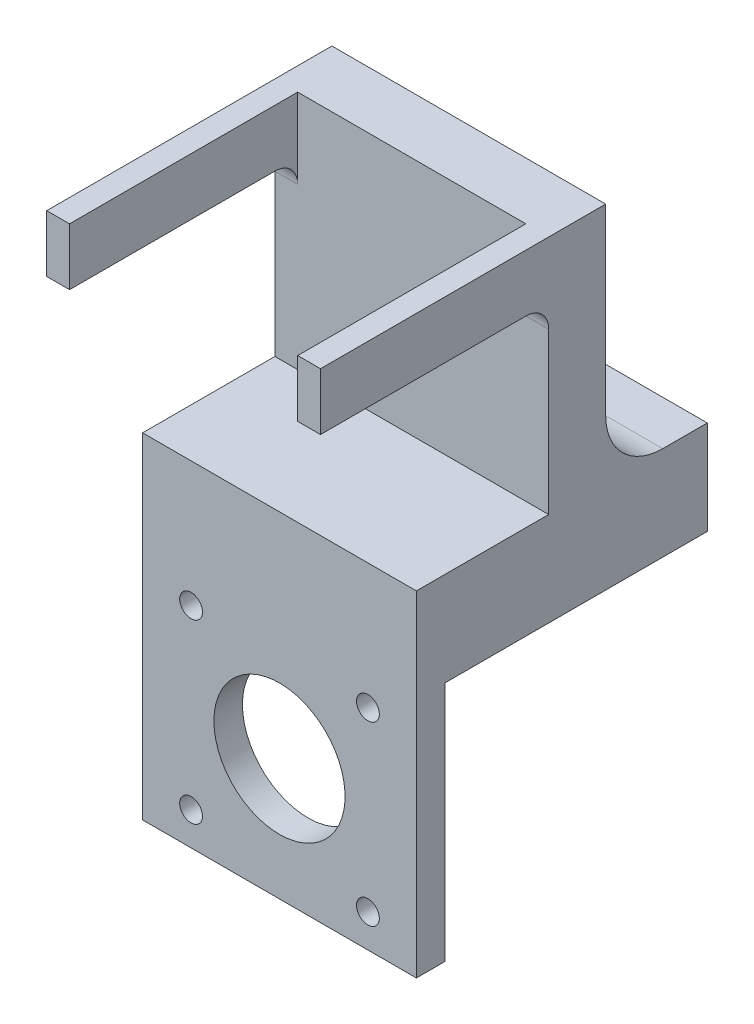
ISO-10303-21;
HEADER;
FILE_DESCRIPTION(('STEP AP214'),'2;1');
FILE_NAME('part.step','',(''),(''),'','','');
FILE_SCHEMA(('AUTOMOTIVE_DESIGN { 1 0 10303 214 1 1 1 1 }'));
ENDSEC;
DATA;
#1=APPLICATION_CONTEXT('core data for automotive mechanical design processes');
#2=APPLICATION_PROTOCOL_DEFINITION('international standard','automotive_design',2000,#1);
#3=PRODUCT_CONTEXT('',#1,'mechanical');
#4=PRODUCT('Part','Part','',(#3));
#5=PRODUCT_RELATED_PRODUCT_CATEGORY('part','',(#4));
#6=PRODUCT_DEFINITION_FORMATION('','',#4);
#7=PRODUCT_DEFINITION_CONTEXT('part definition',#1,'design');
#8=PRODUCT_DEFINITION('design','',#6,#7);
#9=PRODUCT_DEFINITION_SHAPE('','',#8);
#10=(LENGTH_UNIT() NAMED_UNIT(*) SI_UNIT(.MILLI.,.METRE.));
#11=(NAMED_UNIT(*) PLANE_ANGLE_UNIT() SI_UNIT($,.RADIAN.));
#12=(NAMED_UNIT(*) SI_UNIT($,.STERADIAN.) SOLID_ANGLE_UNIT());
#13=UNCERTAINTY_MEASURE_WITH_UNIT(LENGTH_MEASURE(1.E-05),#10,'distance_accuracy_value','');
#14=(GEOMETRIC_REPRESENTATION_CONTEXT(3) GLOBAL_UNCERTAINTY_ASSIGNED_CONTEXT((#13)) GLOBAL_UNIT_ASSIGNED_CONTEXT((#10,
#11,#12)) REPRESENTATION_CONTEXT('',''));
#15=CARTESIAN_POINT('',(0.,0.,0.));
#16=DIRECTION('',(0.,0.,1.));
#17=DIRECTION('',(1.,0.,0.));
#18=AXIS2_PLACEMENT_3D('',#15,#16,#17);
#19=CARTESIAN_POINT('',(0.,0.,0.));
#20=DIRECTION('',(0.,0.,-1.));
#21=DIRECTION('',(-1.,0.,0.));
#22=AXIS2_PLACEMENT_3D('',#19,#20,#21);
#23=PLANE('',#22);
#24=DIRECTION('',(0.,1.,0.));
#25=VECTOR('',#24,1.);
#26=CARTESIAN_POINT('',(48.,0.,0.));
#27=LINE('',#26,#25);
#28=CARTESIAN_POINT('',(48.,20.8609375,0.));
#29=VERTEX_POINT('',#28);
#30=CARTESIAN_POINT('',(48.,53.,0.));
#31=VERTEX_POINT('',#30);
#32=EDGE_CURVE('E316',#29,#31,#27,.T.);
#33=ORIENTED_EDGE('',*,*,#32,.F.);
#34=DIRECTION('',(-1.,0.,0.));
#35=VECTOR('',#34,1.);
#36=CARTESIAN_POINT('',(0.,20.8609375,0.));
#37=LINE('',#36,#35);
#38=CARTESIAN_POINT('',(0.,20.8609375,0.));
#39=VERTEX_POINT('',#38);
#40=EDGE_CURVE('E324',#29,#39,#37,.T.);
#41=ORIENTED_EDGE('',*,*,#40,.T.);
#42=DIRECTION('',(0.,-1.,0.));
#43=VECTOR('',#42,1.);
#44=CARTESIAN_POINT('',(0.,0.,0.));
#45=LINE('',#44,#43);
#46=CARTESIAN_POINT('',(0.,53.,0.));
#47=VERTEX_POINT('',#46);
#48=EDGE_CURVE('E303',#47,#39,#45,.T.);
#49=ORIENTED_EDGE('',*,*,#48,.F.);
#50=DIRECTION('',(-1.,0.,0.));
#51=VECTOR('',#50,1.);
#52=CARTESIAN_POINT('',(0.,53.,0.));
#53=LINE('',#52,#51);
#54=EDGE_CURVE('E308',#31,#47,#53,.T.);
#55=ORIENTED_EDGE('',*,*,#54,.F.);
#56=EDGE_LOOP('',(#33,#41,#49,#55));
#57=FACE_BOUND('',#56,.T.);
#58=ADVANCED_FACE('F33',(#57),#23,.T.);
#59=CARTESIAN_POINT('',(0.,0.,10.));
#60=DIRECTION('',(0.,0.,-1.));
#61=DIRECTION('',(-1.,0.,0.));
#62=AXIS2_PLACEMENT_3D('',#59,#60,#61);
#63=PLANE('',#62);
#64=DIRECTION('',(0.,1.,0.));
#65=VECTOR('',#64,1.);
#66=CARTESIAN_POINT('',(4.,53.,10.));
#67=LINE('',#66,#65);
#68=CARTESIAN_POINT('',(4.,39.,10.));
#69=VERTEX_POINT('',#68);
#70=CARTESIAN_POINT('',(4.,53.,10.));
#71=VERTEX_POINT('',#70);
#72=EDGE_CURVE('E275',#69,#71,#67,.T.);
#73=ORIENTED_EDGE('',*,*,#72,.F.);
#74=DIRECTION('',(1.,0.,0.));
#75=VECTOR('',#74,1.);
#76=CARTESIAN_POINT('',(0.,39.,10.));
#77=LINE('',#76,#75);
#78=CARTESIAN_POINT('',(0.,39.,10.));
#79=VERTEX_POINT('',#78);
#80=EDGE_CURVE('E338',#69,#79,#77,.F.);
#81=ORIENTED_EDGE('',*,*,#80,.T.);
#82=DIRECTION('',(0.,-1.,0.));
#83=VECTOR('',#82,1.);
#84=CARTESIAN_POINT('',(0.,0.,10.));
#85=LINE('',#84,#83);
#86=CARTESIAN_POINT('',(0.,10.8609375,10.));
#87=VERTEX_POINT('',#86);
#88=EDGE_CURVE('E305',#79,#87,#85,.T.);
#89=ORIENTED_EDGE('',*,*,#88,.T.);
#90=DIRECTION('',(-1.,0.,0.));
#91=VECTOR('',#90,1.);
#92=CARTESIAN_POINT('',(0.,10.8609375,10.));
#93=LINE('',#92,#91);
#94=CARTESIAN_POINT('',(48.,10.8609375,10.));
#95=VERTEX_POINT('',#94);
#96=EDGE_CURVE('E244',#95,#87,#93,.T.);
#97=ORIENTED_EDGE('',*,*,#96,.F.);
#98=DIRECTION('',(0.,1.,0.));
#99=VECTOR('',#98,1.);
#100=CARTESIAN_POINT('',(48.,0.,10.));
#101=LINE('',#100,#99);
#102=CARTESIAN_POINT('',(48.,39.,10.));
#103=VERTEX_POINT('',#102);
#104=EDGE_CURVE('E307',#95,#103,#101,.T.);
#105=ORIENTED_EDGE('',*,*,#104,.T.);
#106=DIRECTION('',(1.,0.,0.));
#107=VECTOR('',#106,1.);
#108=CARTESIAN_POINT('',(44.,39.,10.));
#109=LINE('',#108,#107);
#110=CARTESIAN_POINT('',(44.,39.,10.));
#111=VERTEX_POINT('',#110);
#112=EDGE_CURVE('E335',#103,#111,#109,.F.);
#113=ORIENTED_EDGE('',*,*,#112,.T.);
#114=DIRECTION('',(0.,-1.,0.));
#115=VECTOR('',#114,1.);
#116=CARTESIAN_POINT('',(44.,53.,10.));
#117=LINE('',#116,#115);
#118=CARTESIAN_POINT('',(44.,53.,10.));
#119=VERTEX_POINT('',#118);
#120=EDGE_CURVE('E256',#119,#111,#117,.T.);
#121=ORIENTED_EDGE('',*,*,#120,.F.);
#122=DIRECTION('',(-1.,0.,0.));
#123=VECTOR('',#122,1.);
#124=CARTESIAN_POINT('',(0.,53.,10.));
#125=LINE('',#124,#123);
#126=EDGE_CURVE('E311',#119,#71,#125,.T.);
#127=ORIENTED_EDGE('',*,*,#126,.T.);
#128=EDGE_LOOP('',(#73,#81,#89,#97,#105,#113,#121,#127));
#129=FACE_BOUND('',#128,.T.);
#130=ADVANCED_FACE('F350',(#129),#63,.F.);
#131=CARTESIAN_POINT('',(0.,0.,10.));
#132=DIRECTION('',(1.,0.,0.));
#133=DIRECTION('',(0.,0.,-1.));
#134=AXIS2_PLACEMENT_3D('',#131,#132,#133);
#135=PLANE('',#134);
#136=ORIENTED_EDGE('',*,*,#48,.T.);
#137=CARTESIAN_POINT('',(0.,20.8609375,-10.));
#138=DIRECTION('',(1.,0.,0.));
#139=DIRECTION('',(0.,0.,-1.));
#140=AXIS2_PLACEMENT_3D('',#137,#138,#139);
#141=CIRCLE('',#140,10.);
#142=CARTESIAN_POINT('',(0.,10.8609375,-9.99999999999999));
#143=VERTEX_POINT('',#142);
#144=EDGE_CURVE('E328',#39,#143,#141,.T.);
#145=ORIENTED_EDGE('',*,*,#144,.T.);
#146=DIRECTION('',(0.,0.,-1.));
#147=VECTOR('',#146,1.);
#148=CARTESIAN_POINT('',(0.,10.8609375,0.));
#149=LINE('',#148,#147);
#150=CARTESIAN_POINT('',(0.,10.8609375,-17.8082122));
#151=VERTEX_POINT('',#150);
#152=EDGE_CURVE('E174',#143,#151,#149,.T.);
#153=ORIENTED_EDGE('',*,*,#152,.T.);
#154=DIRECTION('',(0.,1.,0.));
#155=VECTOR('',#154,1.);
#156=CARTESIAN_POINT('',(0.,10.8609375,-17.8082122));
#157=LINE('',#156,#155);
#158=CARTESIAN_POINT('',(0.,-5.616325,-17.8082122));
#159=VERTEX_POINT('',#158);
#160=EDGE_CURVE('E183',#159,#151,#157,.T.);
#161=ORIENTED_EDGE('',*,*,#160,.F.);
#162=DIRECTION('',(0.,0.,-1.));
#163=VECTOR('',#162,1.);
#164=CARTESIAN_POINT('',(0.,-5.616325,33.1917878));
#165=LINE('',#164,#163);
#166=CARTESIAN_POINT('',(0.,-5.616325,28.1917878));
#167=VERTEX_POINT('',#166);
#168=EDGE_CURVE('E301',#167,#159,#165,.T.);
#169=ORIENTED_EDGE('',*,*,#168,.F.);
#170=DIRECTION('',(0.,1.,0.));
#171=VECTOR('',#170,1.);
#172=CARTESIAN_POINT('',(0.,-47.916325,28.1917878));
#173=LINE('',#172,#171);
#174=CARTESIAN_POINT('',(0.,-47.916325,28.1917878));
#175=VERTEX_POINT('',#174);
#176=EDGE_CURVE('E241',#175,#167,#173,.T.);
#177=ORIENTED_EDGE('',*,*,#176,.F.);
#178=DIRECTION('',(0.,0.,-1.));
#179=VECTOR('',#178,1.);
#180=CARTESIAN_POINT('',(0.,-47.916325,28.1917878));
#181=LINE('',#180,#179);
#182=CARTESIAN_POINT('',(0.,-47.916325,33.1917878));
#183=VERTEX_POINT('',#182);
#184=EDGE_CURVE('E226',#183,#175,#181,.T.);
#185=ORIENTED_EDGE('',*,*,#184,.F.);
#186=DIRECTION('',(0.,1.,0.));
#187=VECTOR('',#186,1.);
#188=CARTESIAN_POINT('',(0.,0.,33.1917878));
#189=LINE('',#188,#187);
#190=CARTESIAN_POINT('',(0.,10.8609375,33.1917878));
#191=VERTEX_POINT('',#190);
#192=EDGE_CURVE('E299',#183,#191,#189,.T.);
#193=ORIENTED_EDGE('',*,*,#192,.T.);
#194=DIRECTION('',(0.,0.,-1.));
#195=VECTOR('',#194,1.);
#196=CARTESIAN_POINT('',(0.,10.8609375,82.405200233796));
#197=LINE('',#196,#195);
#198=EDGE_CURVE('E247',#191,#87,#197,.T.);
#199=ORIENTED_EDGE('',*,*,#198,.T.);
#200=ORIENTED_EDGE('',*,*,#88,.F.);
#201=CARTESIAN_POINT('',(0.,39.,14.));
#202=DIRECTION('',(1.,0.,0.));
#203=DIRECTION('',(0.,0.,-1.));
#204=AXIS2_PLACEMENT_3D('',#201,#202,#203);
#205=CIRCLE('',#204,4.);
#206=CARTESIAN_POINT('',(0.,43.,14.));
#207=VERTEX_POINT('',#206);
#208=EDGE_CURVE('E345',#79,#207,#205,.T.);
#209=ORIENTED_EDGE('',*,*,#208,.T.);
#210=DIRECTION('',(0.,0.,-1.));
#211=VECTOR('',#210,1.);
#212=CARTESIAN_POINT('',(0.,43.,50.));
#213=LINE('',#212,#211);
#214=CARTESIAN_POINT('',(0.,43.,50.));
#215=VERTEX_POINT('',#214);
#216=EDGE_CURVE('E294',#215,#207,#213,.T.);
#217=ORIENTED_EDGE('',*,*,#216,.F.);
#218=DIRECTION('',(0.,-1.,0.));
#219=VECTOR('',#218,1.);
#220=CARTESIAN_POINT('',(0.,53.,50.));
#221=LINE('',#220,#219);
#222=CARTESIAN_POINT('',(0.,53.,50.));
#223=VERTEX_POINT('',#222);
#224=EDGE_CURVE('E276',#223,#215,#221,.T.);
#225=ORIENTED_EDGE('',*,*,#224,.F.);
#226=DIRECTION('',(0.,0.,-1.));
#227=VECTOR('',#226,1.);
#228=CARTESIAN_POINT('',(0.,53.,10.));
#229=LINE('',#228,#227);
#230=EDGE_CURVE('E313',#223,#47,#229,.T.);
#231=ORIENTED_EDGE('',*,*,#230,.T.);
#232=EDGE_LOOP('',(#136,#145,#153,#161,#169,#177,#185,#193,#199,#200,#209,#217,#225,#231));
#233=FACE_BOUND('',#232,.T.);
#234=ADVANCED_FACE('F376',(#233),#135,.F.);
#235=CARTESIAN_POINT('',(48.,0.,10.));
#236=DIRECTION('',(-1.,0.,0.));
#237=DIRECTION('',(0.,0.,1.));
#238=AXIS2_PLACEMENT_3D('',#235,#236,#237);
#239=PLANE('',#238);
#240=ORIENTED_EDGE('',*,*,#104,.F.);
#241=DIRECTION('',(0.,0.,-1.));
#242=VECTOR('',#241,1.);
#243=CARTESIAN_POINT('',(48.,10.8609375,82.405200233796));
#244=LINE('',#243,#242);
#245=CARTESIAN_POINT('',(48.,10.8609375,33.1917878));
#246=VERTEX_POINT('',#245);
#247=EDGE_CURVE('E250',#246,#95,#244,.T.);
#248=ORIENTED_EDGE('',*,*,#247,.F.);
#249=DIRECTION('',(0.,-1.,0.));
#250=VECTOR('',#249,1.);
#251=CARTESIAN_POINT('',(48.,0.,33.1917878));
#252=LINE('',#251,#250);
#253=CARTESIAN_POINT('',(48.,-47.916325,33.1917878));
#254=VERTEX_POINT('',#253);
#255=EDGE_CURVE('E297',#246,#254,#252,.T.);
#256=ORIENTED_EDGE('',*,*,#255,.T.);
#257=DIRECTION('',(0.,0.,1.));
#258=VECTOR('',#257,1.);
#259=CARTESIAN_POINT('',(48.,-47.916325,28.1917878));
#260=LINE('',#259,#258);
#261=CARTESIAN_POINT('',(48.,-47.916325,28.1917878));
#262=VERTEX_POINT('',#261);
#263=EDGE_CURVE('E231',#262,#254,#260,.T.);
#264=ORIENTED_EDGE('',*,*,#263,.F.);
#265=DIRECTION('',(0.,1.,0.));
#266=VECTOR('',#265,1.);
#267=CARTESIAN_POINT('',(48.,-47.916325,28.1917878));
#268=LINE('',#267,#266);
#269=CARTESIAN_POINT('',(48.,-5.616325,28.1917878));
#270=VERTEX_POINT('',#269);
#271=EDGE_CURVE('E237',#262,#270,#268,.T.);
#272=ORIENTED_EDGE('',*,*,#271,.T.);
#273=DIRECTION('',(0.,0.,-1.));
#274=VECTOR('',#273,1.);
#275=CARTESIAN_POINT('',(48.,-5.616325,33.1917878));
#276=LINE('',#275,#274);
#277=CARTESIAN_POINT('',(48.,-5.616325,-17.8082122));
#278=VERTEX_POINT('',#277);
#279=EDGE_CURVE('E189',#270,#278,#276,.T.);
#280=ORIENTED_EDGE('',*,*,#279,.T.);
#281=DIRECTION('',(0.,-1.,0.));
#282=VECTOR('',#281,1.);
#283=CARTESIAN_POINT('',(48.,10.8609375,-17.8082122));
#284=LINE('',#283,#282);
#285=CARTESIAN_POINT('',(48.,10.8609375,-17.8082122));
#286=VERTEX_POINT('',#285);
#287=EDGE_CURVE('E181',#286,#278,#284,.T.);
#288=ORIENTED_EDGE('',*,*,#287,.F.);
#289=DIRECTION('',(0.,0.,1.));
#290=VECTOR('',#289,1.);
#291=CARTESIAN_POINT('',(48.,10.8609375,0.));
#292=LINE('',#291,#290);
#293=CARTESIAN_POINT('',(48.,10.8609375,-10.));
#294=VERTEX_POINT('',#293);
#295=EDGE_CURVE('E163',#286,#294,#292,.T.);
#296=ORIENTED_EDGE('',*,*,#295,.T.);
#297=CARTESIAN_POINT('',(48.,20.8609375,-10.));
#298=DIRECTION('',(-1.,0.,0.));
#299=DIRECTION('',(0.,0.,1.));
#300=AXIS2_PLACEMENT_3D('',#297,#298,#299);
#301=CIRCLE('',#300,10.);
#302=EDGE_CURVE('E330',#294,#29,#301,.T.);
#303=ORIENTED_EDGE('',*,*,#302,.T.);
#304=ORIENTED_EDGE('',*,*,#32,.T.);
#305=DIRECTION('',(0.,0.,-1.));
#306=VECTOR('',#305,1.);
#307=CARTESIAN_POINT('',(48.,53.,10.));
#308=LINE('',#307,#306);
#309=CARTESIAN_POINT('',(48.,53.,50.));
#310=VERTEX_POINT('',#309);
#311=EDGE_CURVE('E321',#310,#31,#308,.T.);
#312=ORIENTED_EDGE('',*,*,#311,.F.);
#313=DIRECTION('',(0.,1.,0.));
#314=VECTOR('',#313,1.);
#315=CARTESIAN_POINT('',(48.,53.,50.));
#316=LINE('',#315,#314);
#317=CARTESIAN_POINT('',(48.,43.,50.));
#318=VERTEX_POINT('',#317);
#319=EDGE_CURVE('E257',#318,#310,#316,.T.);
#320=ORIENTED_EDGE('',*,*,#319,.F.);
#321=DIRECTION('',(0.,0.,-1.));
#322=VECTOR('',#321,1.);
#323=CARTESIAN_POINT('',(48.,43.,50.));
#324=LINE('',#323,#322);
#325=CARTESIAN_POINT('',(48.,43.,14.));
#326=VERTEX_POINT('',#325);
#327=EDGE_CURVE('E266',#318,#326,#324,.T.);
#328=ORIENTED_EDGE('',*,*,#327,.T.);
#329=CARTESIAN_POINT('',(48.,39.,14.));
#330=DIRECTION('',(-1.,0.,0.));
#331=DIRECTION('',(0.,0.,1.));
#332=AXIS2_PLACEMENT_3D('',#329,#330,#331);
#333=CIRCLE('',#332,4.);
#334=EDGE_CURVE('E41',#326,#103,#333,.T.);
#335=ORIENTED_EDGE('',*,*,#334,.T.);
#336=EDGE_LOOP('',(#240,#248,#256,#264,#272,#280,#288,#296,#303,#304,#312,#320,#328,#335));
#337=FACE_BOUND('',#336,.T.);
#338=ADVANCED_FACE('F187',(#337),#239,.F.);
#339=CARTESIAN_POINT('',(0.,53.,10.));
#340=DIRECTION('',(0.,-1.,0.));
#341=DIRECTION('',(0.,0.,-1.));
#342=AXIS2_PLACEMENT_3D('',#339,#340,#341);
#343=PLANE('',#342);
#344=ORIENTED_EDGE('',*,*,#54,.T.);
#345=ORIENTED_EDGE('',*,*,#230,.F.);
#346=DIRECTION('',(-1.,0.,0.));
#347=VECTOR('',#346,1.);
#348=CARTESIAN_POINT('',(0.,53.,50.));
#349=LINE('',#348,#347);
#350=CARTESIAN_POINT('',(4.,53.,50.));
#351=VERTEX_POINT('',#350);
#352=EDGE_CURVE('E283',#351,#223,#349,.T.);
#353=ORIENTED_EDGE('',*,*,#352,.F.);
#354=DIRECTION('',(0.,0.,-1.));
#355=VECTOR('',#354,1.);
#356=CARTESIAN_POINT('',(4.,53.,50.));
#357=LINE('',#356,#355);
#358=EDGE_CURVE('E286',#351,#71,#357,.T.);
#359=ORIENTED_EDGE('',*,*,#358,.T.);
#360=ORIENTED_EDGE('',*,*,#126,.F.);
#361=DIRECTION('',(0.,0.,-1.));
#362=VECTOR('',#361,1.);
#363=CARTESIAN_POINT('',(44.,53.,50.));
#364=LINE('',#363,#362);
#365=CARTESIAN_POINT('',(44.,53.,50.));
#366=VERTEX_POINT('',#365);
#367=EDGE_CURVE('E272',#366,#119,#364,.T.);
#368=ORIENTED_EDGE('',*,*,#367,.F.);
#369=DIRECTION('',(-1.,0.,0.));
#370=VECTOR('',#369,1.);
#371=CARTESIAN_POINT('',(48.,53.,50.));
#372=LINE('',#371,#370);
#373=EDGE_CURVE('E260',#310,#366,#372,.T.);
#374=ORIENTED_EDGE('',*,*,#373,.F.);
#375=ORIENTED_EDGE('',*,*,#311,.T.);
#376=EDGE_LOOP('',(#344,#345,#353,#359,#360,#368,#374,#375));
#377=FACE_BOUND('',#376,.T.);
#378=ADVANCED_FACE('F362',(#377),#343,.F.);
#379=CARTESIAN_POINT('',(48.,-5.616325,33.1917878));
#380=DIRECTION('',(0.,-1.,0.));
#381=DIRECTION('',(0.,0.,-1.));
#382=AXIS2_PLACEMENT_3D('',#379,#380,#381);
#383=PLANE('',#382);
#384=DIRECTION('',(1.,0.,0.));
#385=VECTOR('',#384,1.);
#386=CARTESIAN_POINT('',(0.,-5.616325,28.1917878));
#387=LINE('',#386,#385);
#388=EDGE_CURVE('E173',#167,#270,#387,.T.);
#389=ORIENTED_EDGE('',*,*,#388,.F.);
#390=ORIENTED_EDGE('',*,*,#168,.T.);
#391=DIRECTION('',(1.,0.,0.));
#392=VECTOR('',#391,1.);
#393=CARTESIAN_POINT('',(-17.2191805697573,-5.616325,-17.8082122));
#394=LINE('',#393,#392);
#395=EDGE_CURVE('E184',#159,#278,#394,.T.);
#396=ORIENTED_EDGE('',*,*,#395,.T.);
#397=ORIENTED_EDGE('',*,*,#279,.F.);
#398=EDGE_LOOP('',(#389,#390,#396,#397));
#399=FACE_BOUND('',#398,.T.);
#400=ADVANCED_FACE('F392',(#399),#383,.T.);
#401=CARTESIAN_POINT('',(0.,0.,33.1917878));
#402=DIRECTION('',(0.,0.,-1.));
#403=DIRECTION('',(-1.,0.,0.));
#404=AXIS2_PLACEMENT_3D('',#401,#402,#403);
#405=PLANE('',#404);
#406=CARTESIAN_POINT('',(8.5,-42.116325,33.1917878));
#407=DIRECTION('',(0.,0.,-1.));
#408=DIRECTION('',(-1.,0.,0.));
#409=AXIS2_PLACEMENT_3D('',#406,#407,#408);
#410=CIRCLE('',#409,2.);
#411=CARTESIAN_POINT('',(6.5,-42.116325,33.1917878));
#412=VERTEX_POINT('',#411);
#413=EDGE_CURVE('E212',#412,#412,#410,.F.);
#414=ORIENTED_EDGE('',*,*,#413,.F.);
#415=EDGE_LOOP('',(#414));
#416=FACE_BOUND('',#415,.T.);
#417=CARTESIAN_POINT('',(8.5,-11.116325,33.1917878));
#418=DIRECTION('',(0.,0.,-1.));
#419=DIRECTION('',(-1.,0.,0.));
#420=AXIS2_PLACEMENT_3D('',#417,#418,#419);
#421=CIRCLE('',#420,2.);
#422=CARTESIAN_POINT('',(6.5,-11.116325,33.1917878));
#423=VERTEX_POINT('',#422);
#424=EDGE_CURVE('E206',#423,#423,#421,.F.);
#425=ORIENTED_EDGE('',*,*,#424,.F.);
#426=EDGE_LOOP('',(#425));
#427=FACE_BOUND('',#426,.T.);
#428=CARTESIAN_POINT('',(39.5,-42.116325,33.1917878));
#429=DIRECTION('',(0.,0.,-1.));
#430=DIRECTION('',(-1.,0.,0.));
#431=AXIS2_PLACEMENT_3D('',#428,#429,#430);
#432=CIRCLE('',#431,2.);
#433=CARTESIAN_POINT('',(37.5,-42.116325,33.1917878));
#434=VERTEX_POINT('',#433);
#435=EDGE_CURVE('E199',#434,#434,#432,.F.);
#436=ORIENTED_EDGE('',*,*,#435,.F.);
#437=EDGE_LOOP('',(#436));
#438=FACE_BOUND('',#437,.T.);
#439=CARTESIAN_POINT('',(39.5,-11.116325,33.1917878));
#440=DIRECTION('',(0.,0.,-1.));
#441=DIRECTION('',(-1.,0.,0.));
#442=AXIS2_PLACEMENT_3D('',#439,#440,#441);
#443=CIRCLE('',#442,2.);
#444=CARTESIAN_POINT('',(37.5,-11.116325,33.1917878));
#445=VERTEX_POINT('',#444);
#446=EDGE_CURVE('E198',#445,#445,#443,.F.);
#447=ORIENTED_EDGE('',*,*,#446,.F.);
#448=EDGE_LOOP('',(#447));
#449=FACE_BOUND('',#448,.T.);
#450=CARTESIAN_POINT('',(24.,-26.616325,33.1917878));
#451=DIRECTION('',(0.,0.,-1.));
#452=DIRECTION('',(-1.,0.,0.));
#453=AXIS2_PLACEMENT_3D('',#450,#451,#452);
#454=CIRCLE('',#453,11.5);
#455=CARTESIAN_POINT('',(12.5,-26.616325,33.1917878));
#456=VERTEX_POINT('',#455);
#457=EDGE_CURVE('E222',#456,#456,#454,.F.);
#458=ORIENTED_EDGE('',*,*,#457,.F.);
#459=EDGE_LOOP('',(#458));
#460=FACE_BOUND('',#459,.T.);
#461=ORIENTED_EDGE('',*,*,#255,.F.);
#462=DIRECTION('',(1.,0.,0.));
#463=VECTOR('',#462,1.);
#464=CARTESIAN_POINT('',(0.,10.8609375,33.1917878));
#465=LINE('',#464,#463);
#466=EDGE_CURVE('E253',#191,#246,#465,.T.);
#467=ORIENTED_EDGE('',*,*,#466,.F.);
#468=ORIENTED_EDGE('',*,*,#192,.F.);
#469=DIRECTION('',(-1.,0.,0.));
#470=VECTOR('',#469,1.);
#471=CARTESIAN_POINT('',(0.,-47.916325,33.1917878));
#472=LINE('',#471,#470);
#473=EDGE_CURVE('E234',#254,#183,#472,.T.);
#474=ORIENTED_EDGE('',*,*,#473,.F.);
#475=EDGE_LOOP('',(#461,#467,#468,#474));
#476=FACE_BOUND('',#475,.T.);
#477=ADVANCED_FACE('F389',(#416,#427,#438,#449,#460,#476),#405,.F.);
#478=CARTESIAN_POINT('',(0.,43.,50.));
#479=DIRECTION('',(0.,1.,0.));
#480=DIRECTION('',(0.,0.,1.));
#481=AXIS2_PLACEMENT_3D('',#478,#479,#480);
#482=PLANE('',#481);
#483=ORIENTED_EDGE('',*,*,#216,.T.);
#484=DIRECTION('',(1.,0.,0.));
#485=VECTOR('',#484,1.);
#486=CARTESIAN_POINT('',(4.,43.,14.));
#487=LINE('',#486,#485);
#488=CARTESIAN_POINT('',(4.,43.,14.));
#489=VERTEX_POINT('',#488);
#490=EDGE_CURVE('E332',#207,#489,#487,.T.);
#491=ORIENTED_EDGE('',*,*,#490,.T.);
#492=DIRECTION('',(0.,0.,-1.));
#493=VECTOR('',#492,1.);
#494=CARTESIAN_POINT('',(4.,43.,50.));
#495=LINE('',#494,#493);
#496=CARTESIAN_POINT('',(4.,43.,50.));
#497=VERTEX_POINT('',#496);
#498=EDGE_CURVE('E291',#497,#489,#495,.T.);
#499=ORIENTED_EDGE('',*,*,#498,.F.);
#500=DIRECTION('',(1.,0.,0.));
#501=VECTOR('',#500,1.);
#502=CARTESIAN_POINT('',(0.,43.,50.));
#503=LINE('',#502,#501);
#504=EDGE_CURVE('E279',#215,#497,#503,.T.);
#505=ORIENTED_EDGE('',*,*,#504,.F.);
#506=EDGE_LOOP('',(#483,#491,#499,#505));
#507=FACE_BOUND('',#506,.T.);
#508=ADVANCED_FACE('F391',(#507),#482,.F.);
#509=CARTESIAN_POINT('',(4.,53.,50.));
#510=DIRECTION('',(-1.,0.,0.));
#511=DIRECTION('',(0.,0.,1.));
#512=AXIS2_PLACEMENT_3D('',#509,#510,#511);
#513=PLANE('',#512);
#514=ORIENTED_EDGE('',*,*,#72,.T.);
#515=ORIENTED_EDGE('',*,*,#358,.F.);
#516=DIRECTION('',(0.,1.,0.));
#517=VECTOR('',#516,1.);
#518=CARTESIAN_POINT('',(4.,53.,50.));
#519=LINE('',#518,#517);
#520=EDGE_CURVE('E281',#497,#351,#519,.T.);
#521=ORIENTED_EDGE('',*,*,#520,.F.);
#522=ORIENTED_EDGE('',*,*,#498,.T.);
#523=CARTESIAN_POINT('',(4.,39.,14.));
#524=DIRECTION('',(-1.,0.,0.));
#525=DIRECTION('',(0.,0.,1.));
#526=AXIS2_PLACEMENT_3D('',#523,#524,#525);
#527=CIRCLE('',#526,4.);
#528=EDGE_CURVE('E342',#489,#69,#527,.T.);
#529=ORIENTED_EDGE('',*,*,#528,.T.);
#530=EDGE_LOOP('',(#514,#515,#521,#522,#529));
#531=FACE_BOUND('',#530,.T.);
#532=ADVANCED_FACE('F366',(#531),#513,.F.);
#533=CARTESIAN_POINT('',(0.,0.,50.));
#534=DIRECTION('',(0.,0.,1.));
#535=DIRECTION('',(1.,0.,0.));
#536=AXIS2_PLACEMENT_3D('',#533,#534,#535);
#537=PLANE('',#536);
#538=ORIENTED_EDGE('',*,*,#224,.T.);
#539=ORIENTED_EDGE('',*,*,#504,.T.);
#540=ORIENTED_EDGE('',*,*,#520,.T.);
#541=ORIENTED_EDGE('',*,*,#352,.T.);
#542=EDGE_LOOP('',(#538,#539,#540,#541));
#543=FACE_BOUND('',#542,.T.);
#544=ADVANCED_FACE('F472',(#543),#537,.T.);
#545=CARTESIAN_POINT('',(44.,53.,50.));
#546=DIRECTION('',(1.,0.,0.));
#547=DIRECTION('',(0.,0.,-1.));
#548=AXIS2_PLACEMENT_3D('',#545,#546,#547);
#549=PLANE('',#548);
#550=ORIENTED_EDGE('',*,*,#120,.T.);
#551=CARTESIAN_POINT('',(44.,39.,14.));
#552=DIRECTION('',(1.,0.,0.));
#553=DIRECTION('',(0.,0.,-1.));
#554=AXIS2_PLACEMENT_3D('',#551,#552,#553);
#555=CIRCLE('',#554,4.);
#556=CARTESIAN_POINT('',(44.,43.,14.));
#557=VERTEX_POINT('',#556);
#558=EDGE_CURVE('E11',#111,#557,#555,.T.);
#559=ORIENTED_EDGE('',*,*,#558,.T.);
#560=DIRECTION('',(0.,0.,-1.));
#561=VECTOR('',#560,1.);
#562=CARTESIAN_POINT('',(44.,43.,50.));
#563=LINE('',#562,#561);
#564=CARTESIAN_POINT('',(44.,43.,50.));
#565=VERTEX_POINT('',#564);
#566=EDGE_CURVE('E270',#565,#557,#563,.T.);
#567=ORIENTED_EDGE('',*,*,#566,.F.);
#568=DIRECTION('',(0.,-1.,0.));
#569=VECTOR('',#568,1.);
#570=CARTESIAN_POINT('',(44.,53.,50.));
#571=LINE('',#570,#569);
#572=EDGE_CURVE('E262',#366,#565,#571,.T.);
#573=ORIENTED_EDGE('',*,*,#572,.F.);
#574=ORIENTED_EDGE('',*,*,#367,.T.);
#575=EDGE_LOOP('',(#550,#559,#567,#573,#574));
#576=FACE_BOUND('',#575,.T.);
#577=ADVANCED_FACE('F356',(#576),#549,.F.);
#578=CARTESIAN_POINT('',(48.,43.,50.));
#579=DIRECTION('',(0.,1.,0.));
#580=DIRECTION('',(0.,0.,1.));
#581=AXIS2_PLACEMENT_3D('',#578,#579,#580);
#582=PLANE('',#581);
#583=ORIENTED_EDGE('',*,*,#566,.T.);
#584=DIRECTION('',(1.,0.,0.));
#585=VECTOR('',#584,1.);
#586=CARTESIAN_POINT('',(48.,43.,14.));
#587=LINE('',#586,#585);
#588=EDGE_CURVE('E340',#557,#326,#587,.T.);
#589=ORIENTED_EDGE('',*,*,#588,.T.);
#590=ORIENTED_EDGE('',*,*,#327,.F.);
#591=DIRECTION('',(1.,0.,0.));
#592=VECTOR('',#591,1.);
#593=CARTESIAN_POINT('',(48.,43.,50.));
#594=LINE('',#593,#592);
#595=EDGE_CURVE('E264',#565,#318,#594,.T.);
#596=ORIENTED_EDGE('',*,*,#595,.F.);
#597=EDGE_LOOP('',(#583,#589,#590,#596));
#598=FACE_BOUND('',#597,.T.);
#599=ADVANCED_FACE('F353',(#598),#582,.F.);
#600=CARTESIAN_POINT('',(0.,0.,50.));
#601=DIRECTION('',(0.,0.,-1.));
#602=DIRECTION('',(-1.,0.,0.));
#603=AXIS2_PLACEMENT_3D('',#600,#601,#602);
#604=PLANE('',#603);
#605=ORIENTED_EDGE('',*,*,#319,.T.);
#606=ORIENTED_EDGE('',*,*,#373,.T.);
#607=ORIENTED_EDGE('',*,*,#572,.T.);
#608=ORIENTED_EDGE('',*,*,#595,.T.);
#609=EDGE_LOOP('',(#605,#606,#607,#608));
#610=FACE_BOUND('',#609,.T.);
#611=ADVANCED_FACE('F359',(#610),#604,.F.);
#612=CARTESIAN_POINT('',(0.,10.8609375,82.405200233796));
#613=DIRECTION('',(0.,-1.,0.));
#614=DIRECTION('',(0.,0.,-1.));
#615=AXIS2_PLACEMENT_3D('',#612,#613,#614);
#616=PLANE('',#615);
#617=ORIENTED_EDGE('',*,*,#198,.F.);
#618=ORIENTED_EDGE('',*,*,#466,.T.);
#619=ORIENTED_EDGE('',*,*,#247,.T.);
#620=ORIENTED_EDGE('',*,*,#96,.T.);
#621=EDGE_LOOP('',(#617,#618,#619,#620));
#622=FACE_BOUND('',#621,.T.);
#623=ADVANCED_FACE('F382',(#622),#616,.F.);
#624=CARTESIAN_POINT('',(0.,-47.916325,28.1917878));
#625=DIRECTION('',(0.,0.,1.));
#626=DIRECTION('',(1.,0.,0.));
#627=AXIS2_PLACEMENT_3D('',#624,#625,#626);
#628=PLANE('',#627);
#629=CARTESIAN_POINT('',(8.5,-42.116325,28.1917878));
#630=DIRECTION('',(0.,0.,-1.));
#631=DIRECTION('',(-1.,0.,0.));
#632=AXIS2_PLACEMENT_3D('',#629,#630,#631);
#633=CIRCLE('',#632,2.);
#634=CARTESIAN_POINT('',(6.5,-42.116325,28.1917878));
#635=VERTEX_POINT('',#634);
#636=EDGE_CURVE('E215',#635,#635,#633,.T.);
#637=ORIENTED_EDGE('',*,*,#636,.F.);
#638=EDGE_LOOP('',(#637));
#639=FACE_BOUND('',#638,.T.);
#640=CARTESIAN_POINT('',(8.5,-11.116325,28.1917878));
#641=DIRECTION('',(0.,0.,-1.));
#642=DIRECTION('',(-1.,0.,0.));
#643=AXIS2_PLACEMENT_3D('',#640,#641,#642);
#644=CIRCLE('',#643,2.);
#645=CARTESIAN_POINT('',(6.5,-11.116325,28.1917878));
#646=VERTEX_POINT('',#645);
#647=EDGE_CURVE('E209',#646,#646,#644,.T.);
#648=ORIENTED_EDGE('',*,*,#647,.F.);
#649=EDGE_LOOP('',(#648));
#650=FACE_BOUND('',#649,.T.);
#651=CARTESIAN_POINT('',(39.5,-42.116325,28.1917878));
#652=DIRECTION('',(0.,0.,-1.));
#653=DIRECTION('',(-1.,0.,0.));
#654=AXIS2_PLACEMENT_3D('',#651,#652,#653);
#655=CIRCLE('',#654,2.);
#656=CARTESIAN_POINT('',(37.5,-42.116325,28.1917878));
#657=VERTEX_POINT('',#656);
#658=EDGE_CURVE('E203',#657,#657,#655,.T.);
#659=ORIENTED_EDGE('',*,*,#658,.F.);
#660=EDGE_LOOP('',(#659));
#661=FACE_BOUND('',#660,.T.);
#662=CARTESIAN_POINT('',(39.5,-11.116325,28.1917878));
#663=DIRECTION('',(0.,0.,-1.));
#664=DIRECTION('',(-1.,0.,0.));
#665=AXIS2_PLACEMENT_3D('',#662,#663,#664);
#666=CIRCLE('',#665,2.);
#667=CARTESIAN_POINT('',(37.5,-11.116325,28.1917878));
#668=VERTEX_POINT('',#667);
#669=EDGE_CURVE('E195',#668,#668,#666,.T.);
#670=ORIENTED_EDGE('',*,*,#669,.F.);
#671=EDGE_LOOP('',(#670));
#672=FACE_BOUND('',#671,.T.);
#673=CARTESIAN_POINT('',(24.,-26.616325,28.1917878));
#674=DIRECTION('',(0.,0.,-1.));
#675=DIRECTION('',(-1.,0.,0.));
#676=AXIS2_PLACEMENT_3D('',#673,#674,#675);
#677=CIRCLE('',#676,11.5);
#678=CARTESIAN_POINT('',(12.5,-26.616325,28.1917878));
#679=VERTEX_POINT('',#678);
#680=EDGE_CURVE('E202',#679,#679,#677,.T.);
#681=ORIENTED_EDGE('',*,*,#680,.F.);
#682=EDGE_LOOP('',(#681));
#683=FACE_BOUND('',#682,.T.);
#684=ORIENTED_EDGE('',*,*,#388,.T.);
#685=ORIENTED_EDGE('',*,*,#271,.F.);
#686=DIRECTION('',(1.,0.,0.));
#687=VECTOR('',#686,1.);
#688=CARTESIAN_POINT('',(0.,-47.916325,28.1917878));
#689=LINE('',#688,#687);
#690=EDGE_CURVE('E229',#175,#262,#689,.T.);
#691=ORIENTED_EDGE('',*,*,#690,.F.);
#692=ORIENTED_EDGE('',*,*,#176,.T.);
#693=EDGE_LOOP('',(#684,#685,#691,#692));
#694=FACE_BOUND('',#693,.T.);
#695=ADVANCED_FACE('F461',(#639,#650,#661,#672,#683,#694),#628,.F.);
#696=CARTESIAN_POINT('',(0.,-47.916325,0.));
#697=DIRECTION('',(0.,1.,0.));
#698=DIRECTION('',(0.,0.,1.));
#699=AXIS2_PLACEMENT_3D('',#696,#697,#698);
#700=PLANE('',#699);
#701=ORIENTED_EDGE('',*,*,#184,.T.);
#702=ORIENTED_EDGE('',*,*,#690,.T.);
#703=ORIENTED_EDGE('',*,*,#263,.T.);
#704=ORIENTED_EDGE('',*,*,#473,.T.);
#705=EDGE_LOOP('',(#701,#702,#703,#704));
#706=FACE_BOUND('',#705,.T.);
#707=ADVANCED_FACE('F387',(#706),#700,.F.);
#708=CARTESIAN_POINT('',(68.8698461722681,10.8609375,0.));
#709=DIRECTION('',(0.,1.,0.));
#710=DIRECTION('',(0.,0.,1.));
#711=AXIS2_PLACEMENT_3D('',#708,#709,#710);
#712=PLANE('',#711);
#713=ORIENTED_EDGE('',*,*,#152,.F.);
#714=DIRECTION('',(-1.,0.,0.));
#715=VECTOR('',#714,1.);
#716=CARTESIAN_POINT('',(48.,10.8609375,-10.));
#717=LINE('',#716,#715);
#718=EDGE_CURVE('E169',#143,#294,#717,.F.);
#719=ORIENTED_EDGE('',*,*,#718,.T.);
#720=ORIENTED_EDGE('',*,*,#295,.F.);
#721=DIRECTION('',(1.,0.,0.));
#722=VECTOR('',#721,1.);
#723=CARTESIAN_POINT('',(-17.2191805697573,10.8609375,-17.8082122));
#724=LINE('',#723,#722);
#725=EDGE_CURVE('E167',#151,#286,#724,.T.);
#726=ORIENTED_EDGE('',*,*,#725,.F.);
#727=EDGE_LOOP('',(#713,#719,#720,#726));
#728=FACE_BOUND('',#727,.T.);
#729=ADVANCED_FACE('F166',(#728),#712,.T.);
#730=CARTESIAN_POINT('',(24.,-26.616325,50.001));
#731=DIRECTION('',(0.,0.,-1.));
#732=DIRECTION('',(-1.,0.,0.));
#733=AXIS2_PLACEMENT_3D('',#730,#731,#732);
#734=CYLINDRICAL_SURFACE('',#733,11.5);
#735=ORIENTED_EDGE('',*,*,#680,.T.);
#736=EDGE_LOOP('',(#735));
#737=FACE_BOUND('',#736,.T.);
#738=ORIENTED_EDGE('',*,*,#457,.T.);
#739=EDGE_LOOP('',(#738));
#740=FACE_BOUND('',#739,.T.);
#741=ADVANCED_FACE('F442',(#737,#740),#734,.F.);
#742=CARTESIAN_POINT('',(39.5,-11.116325,50.001));
#743=DIRECTION('',(0.,0.,-1.));
#744=DIRECTION('',(-1.,0.,0.));
#745=AXIS2_PLACEMENT_3D('',#742,#743,#744);
#746=CYLINDRICAL_SURFACE('',#745,2.);
#747=ORIENTED_EDGE('',*,*,#669,.T.);
#748=EDGE_LOOP('',(#747));
#749=FACE_BOUND('',#748,.T.);
#750=ORIENTED_EDGE('',*,*,#446,.T.);
#751=EDGE_LOOP('',(#750));
#752=FACE_BOUND('',#751,.T.);
#753=ADVANCED_FACE('F438',(#749,#752),#746,.F.);
#754=CARTESIAN_POINT('',(39.5,-42.116325,50.001));
#755=DIRECTION('',(0.,0.,-1.));
#756=DIRECTION('',(-1.,0.,0.));
#757=AXIS2_PLACEMENT_3D('',#754,#755,#756);
#758=CYLINDRICAL_SURFACE('',#757,2.);
#759=ORIENTED_EDGE('',*,*,#658,.T.);
#760=EDGE_LOOP('',(#759));
#761=FACE_BOUND('',#760,.T.);
#762=ORIENTED_EDGE('',*,*,#435,.T.);
#763=EDGE_LOOP('',(#762));
#764=FACE_BOUND('',#763,.T.);
#765=ADVANCED_FACE('F441',(#761,#764),#758,.F.);
#766=CARTESIAN_POINT('',(8.5,-11.116325,50.001));
#767=DIRECTION('',(0.,0.,-1.));
#768=DIRECTION('',(-1.,0.,0.));
#769=AXIS2_PLACEMENT_3D('',#766,#767,#768);
#770=CYLINDRICAL_SURFACE('',#769,2.);
#771=ORIENTED_EDGE('',*,*,#647,.T.);
#772=EDGE_LOOP('',(#771));
#773=FACE_BOUND('',#772,.T.);
#774=ORIENTED_EDGE('',*,*,#424,.T.);
#775=EDGE_LOOP('',(#774));
#776=FACE_BOUND('',#775,.T.);
#777=ADVANCED_FACE('F446',(#773,#776),#770,.F.);
#778=CARTESIAN_POINT('',(8.5,-42.116325,50.001));
#779=DIRECTION('',(0.,0.,-1.));
#780=DIRECTION('',(-1.,0.,0.));
#781=AXIS2_PLACEMENT_3D('',#778,#779,#780);
#782=CYLINDRICAL_SURFACE('',#781,2.);
#783=ORIENTED_EDGE('',*,*,#636,.T.);
#784=EDGE_LOOP('',(#783));
#785=FACE_BOUND('',#784,.T.);
#786=ORIENTED_EDGE('',*,*,#413,.T.);
#787=EDGE_LOOP('',(#786));
#788=FACE_BOUND('',#787,.T.);
#789=ADVANCED_FACE('F425',(#785,#788),#782,.F.);
#790=CARTESIAN_POINT('',(0.,20.8609375,-10.));
#791=DIRECTION('',(1.,0.,0.));
#792=DIRECTION('',(0.,0.,-1.));
#793=AXIS2_PLACEMENT_3D('',#790,#791,#792);
#794=CYLINDRICAL_SURFACE('',#793,10.);
#795=ORIENTED_EDGE('',*,*,#302,.F.);
#796=ORIENTED_EDGE('',*,*,#718,.F.);
#797=ORIENTED_EDGE('',*,*,#144,.F.);
#798=ORIENTED_EDGE('',*,*,#40,.F.);
#799=EDGE_LOOP('',(#795,#796,#797,#798));
#800=FACE_BOUND('',#799,.T.);
#801=ADVANCED_FACE('F423',(#800),#794,.F.);
#802=CARTESIAN_POINT('',(0.,39.,14.));
#803=DIRECTION('',(-1.,0.,0.));
#804=DIRECTION('',(0.,0.,1.));
#805=AXIS2_PLACEMENT_3D('',#802,#803,#804);
#806=CYLINDRICAL_SURFACE('',#805,4.);
#807=ORIENTED_EDGE('',*,*,#208,.F.);
#808=ORIENTED_EDGE('',*,*,#80,.F.);
#809=ORIENTED_EDGE('',*,*,#528,.F.);
#810=ORIENTED_EDGE('',*,*,#490,.F.);
#811=EDGE_LOOP('',(#807,#808,#809,#810));
#812=FACE_BOUND('',#811,.T.);
#813=ADVANCED_FACE('F373',(#812),#806,.F.);
#814=CARTESIAN_POINT('',(48.,39.,14.));
#815=DIRECTION('',(-1.,0.,0.));
#816=DIRECTION('',(0.,0.,1.));
#817=AXIS2_PLACEMENT_3D('',#814,#815,#816);
#818=CYLINDRICAL_SURFACE('',#817,4.);
#819=ORIENTED_EDGE('',*,*,#558,.F.);
#820=ORIENTED_EDGE('',*,*,#112,.F.);
#821=ORIENTED_EDGE('',*,*,#334,.F.);
#822=ORIENTED_EDGE('',*,*,#588,.F.);
#823=EDGE_LOOP('',(#819,#820,#821,#822));
#824=FACE_BOUND('',#823,.T.);
#825=ADVANCED_FACE('F35',(#824),#818,.F.);
#826=CARTESIAN_POINT('',(-17.2191805697573,10.8609375,-17.8082122));
#827=DIRECTION('',(0.,0.,1.));
#828=DIRECTION('',(0.,-1.,0.));
#829=AXIS2_PLACEMENT_3D('',#826,#827,#828);
#830=PLANE('',#829);
#831=ORIENTED_EDGE('',*,*,#395,.F.);
#832=ORIENTED_EDGE('',*,*,#160,.T.);
#833=ORIENTED_EDGE('',*,*,#725,.T.);
#834=ORIENTED_EDGE('',*,*,#287,.T.);
#835=EDGE_LOOP('',(#831,#832,#833,#834));
#836=FACE_BOUND('',#835,.T.);
#837=ADVANCED_FACE('F180',(#836),#830,.F.);
#838=CLOSED_SHELL('',(#58,#130,#234,#338,#378,#400,#477,#508,#532,#544,#577,#599,#611,#623,#695,
#707,#729,#741,#753,#765,#777,#789,#801,#813,#825,#837));
#839=MANIFOLD_SOLID_BREP('B2',#838);
#840=ADVANCED_BREP_SHAPE_REPRESENTATION('',(#18,#839),#14);
#841=SHAPE_DEFINITION_REPRESENTATION(#9,#840);
ENDSEC;
END-ISO-10303-21;
